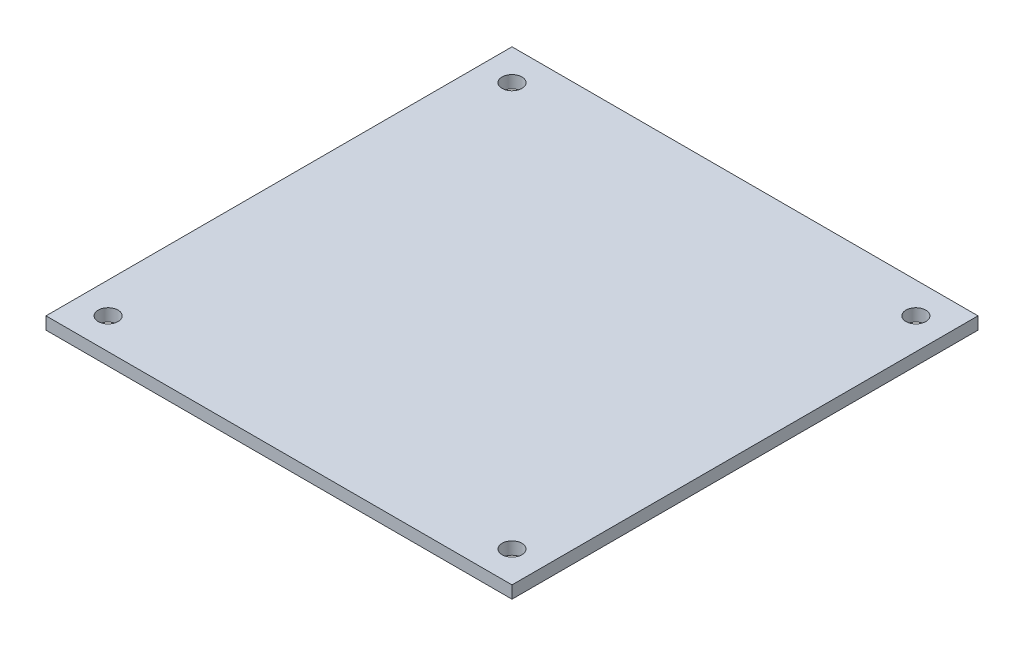
ISO-10303-21;
HEADER;
FILE_DESCRIPTION(('STEP AP214'),'2;1');
FILE_NAME('part.step','',(''),(''),'','','');
FILE_SCHEMA(('AUTOMOTIVE_DESIGN { 1 0 10303 214 1 1 1 1 }'));
ENDSEC;
DATA;
#1=APPLICATION_CONTEXT('core data for automotive mechanical design processes');
#2=APPLICATION_PROTOCOL_DEFINITION('international standard','automotive_design',2000,#1);
#3=PRODUCT_CONTEXT('',#1,'mechanical');
#4=PRODUCT('Part','Part','',(#3));
#5=PRODUCT_RELATED_PRODUCT_CATEGORY('part','',(#4));
#6=PRODUCT_DEFINITION_FORMATION('','',#4);
#7=PRODUCT_DEFINITION_CONTEXT('part definition',#1,'design');
#8=PRODUCT_DEFINITION('design','',#6,#7);
#9=PRODUCT_DEFINITION_SHAPE('','',#8);
#10=(LENGTH_UNIT() NAMED_UNIT(*) SI_UNIT(.MILLI.,.METRE.));
#11=(NAMED_UNIT(*) PLANE_ANGLE_UNIT() SI_UNIT($,.RADIAN.));
#12=(NAMED_UNIT(*) SI_UNIT($,.STERADIAN.) SOLID_ANGLE_UNIT());
#13=UNCERTAINTY_MEASURE_WITH_UNIT(LENGTH_MEASURE(1.E-05),#10,'distance_accuracy_value','');
#14=(GEOMETRIC_REPRESENTATION_CONTEXT(3) GLOBAL_UNCERTAINTY_ASSIGNED_CONTEXT((#13)) GLOBAL_UNIT_ASSIGNED_CONTEXT((#10,
#11,#12)) REPRESENTATION_CONTEXT('',''));
#15=CARTESIAN_POINT('',(0.,0.,0.));
#16=DIRECTION('',(0.,0.,1.));
#17=DIRECTION('',(1.,0.,0.));
#18=AXIS2_PLACEMENT_3D('',#15,#16,#17);
#19=CARTESIAN_POINT('',(0.,2.,-37.5));
#20=DIRECTION('',(0.,0.,-1.));
#21=DIRECTION('',(-1.,0.,0.));
#22=AXIS2_PLACEMENT_3D('',#19,#20,#21);
#23=PLANE('',#22);
#24=DIRECTION('',(1.,0.,0.));
#25=VECTOR('',#24,1.);
#26=CARTESIAN_POINT('',(0.,0.,-37.5));
#27=LINE('',#26,#25);
#28=CARTESIAN_POINT('',(-37.5,0.,-37.5));
#29=VERTEX_POINT('',#28);
#30=CARTESIAN_POINT('',(37.5,0.,-37.5));
#31=VERTEX_POINT('',#30);
#32=EDGE_CURVE('E125',#29,#31,#27,.T.);
#33=ORIENTED_EDGE('',*,*,#32,.F.);
#34=DIRECTION('',(0.,-1.,0.));
#35=VECTOR('',#34,1.);
#36=CARTESIAN_POINT('',(-37.5,2.,-37.5));
#37=LINE('',#36,#35);
#38=CARTESIAN_POINT('',(-37.5,2.,-37.5));
#39=VERTEX_POINT('',#38);
#40=EDGE_CURVE('E11',#39,#29,#37,.T.);
#41=ORIENTED_EDGE('',*,*,#40,.F.);
#42=DIRECTION('',(1.,0.,0.));
#43=VECTOR('',#42,1.);
#44=CARTESIAN_POINT('',(0.,2.,-37.5));
#45=LINE('',#44,#43);
#46=CARTESIAN_POINT('',(37.5,2.,-37.5));
#47=VERTEX_POINT('',#46);
#48=EDGE_CURVE('E102',#39,#47,#45,.T.);
#49=ORIENTED_EDGE('',*,*,#48,.T.);
#50=DIRECTION('',(0.,-1.,0.));
#51=VECTOR('',#50,1.);
#52=CARTESIAN_POINT('',(37.5,2.,-37.5));
#53=LINE('',#52,#51);
#54=EDGE_CURVE('E63',#47,#31,#53,.T.);
#55=ORIENTED_EDGE('',*,*,#54,.T.);
#56=EDGE_LOOP('',(#33,#41,#49,#55));
#57=FACE_BOUND('',#56,.T.);
#58=ADVANCED_FACE('F45',(#57),#23,.T.);
#59=CARTESIAN_POINT('',(-37.5,2.,0.));
#60=DIRECTION('',(1.,0.,0.));
#61=DIRECTION('',(0.,0.,-1.));
#62=AXIS2_PLACEMENT_3D('',#59,#60,#61);
#63=PLANE('',#62);
#64=DIRECTION('',(0.,0.,1.));
#65=VECTOR('',#64,1.);
#66=CARTESIAN_POINT('',(-37.5,0.,0.));
#67=LINE('',#66,#65);
#68=CARTESIAN_POINT('',(-37.5,0.,37.5));
#69=VERTEX_POINT('',#68);
#70=EDGE_CURVE('E108',#29,#69,#67,.T.);
#71=ORIENTED_EDGE('',*,*,#70,.T.);
#72=DIRECTION('',(0.,-1.,0.));
#73=VECTOR('',#72,1.);
#74=CARTESIAN_POINT('',(-37.5,2.,37.5));
#75=LINE('',#74,#73);
#76=CARTESIAN_POINT('',(-37.5,2.,37.5));
#77=VERTEX_POINT('',#76);
#78=EDGE_CURVE('E55',#77,#69,#75,.T.);
#79=ORIENTED_EDGE('',*,*,#78,.F.);
#80=DIRECTION('',(0.,0.,1.));
#81=VECTOR('',#80,1.);
#82=CARTESIAN_POINT('',(-37.5,2.,0.));
#83=LINE('',#82,#81);
#84=EDGE_CURVE('E98',#39,#77,#83,.T.);
#85=ORIENTED_EDGE('',*,*,#84,.F.);
#86=ORIENTED_EDGE('',*,*,#40,.T.);
#87=EDGE_LOOP('',(#71,#79,#85,#86));
#88=FACE_BOUND('',#87,.T.);
#89=ADVANCED_FACE('F106',(#88),#63,.F.);
#90=CARTESIAN_POINT('',(0.,2.,37.5));
#91=DIRECTION('',(0.,0.,-1.));
#92=DIRECTION('',(-1.,0.,0.));
#93=AXIS2_PLACEMENT_3D('',#90,#91,#92);
#94=PLANE('',#93);
#95=DIRECTION('',(1.,0.,0.));
#96=VECTOR('',#95,1.);
#97=CARTESIAN_POINT('',(0.,0.,37.5));
#98=LINE('',#97,#96);
#99=CARTESIAN_POINT('',(37.5,0.,37.5));
#100=VERTEX_POINT('',#99);
#101=EDGE_CURVE('E120',#69,#100,#98,.T.);
#102=ORIENTED_EDGE('',*,*,#101,.T.);
#103=DIRECTION('',(0.,-1.,0.));
#104=VECTOR('',#103,1.);
#105=CARTESIAN_POINT('',(37.5,2.,37.5));
#106=LINE('',#105,#104);
#107=CARTESIAN_POINT('',(37.5,2.,37.5));
#108=VERTEX_POINT('',#107);
#109=EDGE_CURVE('E77',#108,#100,#106,.T.);
#110=ORIENTED_EDGE('',*,*,#109,.F.);
#111=DIRECTION('',(1.,0.,0.));
#112=VECTOR('',#111,1.);
#113=CARTESIAN_POINT('',(0.,2.,37.5));
#114=LINE('',#113,#112);
#115=EDGE_CURVE('E89',#77,#108,#114,.T.);
#116=ORIENTED_EDGE('',*,*,#115,.F.);
#117=ORIENTED_EDGE('',*,*,#78,.T.);
#118=EDGE_LOOP('',(#102,#110,#116,#117));
#119=FACE_BOUND('',#118,.T.);
#120=ADVANCED_FACE('F91',(#119),#94,.F.);
#121=CARTESIAN_POINT('',(-32.5,2.,-32.5));
#122=DIRECTION('',(0.,-1.,0.));
#123=DIRECTION('',(0.,0.,-1.));
#124=AXIS2_PLACEMENT_3D('',#121,#122,#123);
#125=CYLINDRICAL_SURFACE('',#124,1.6);
#126=CARTESIAN_POINT('',(-32.5,2.,-32.5));
#127=DIRECTION('',(0.,1.,0.));
#128=DIRECTION('',(0.,0.,1.));
#129=AXIS2_PLACEMENT_3D('',#126,#127,#128);
#130=CIRCLE('',#129,1.6);
#131=CARTESIAN_POINT('',(-32.5,2.,-30.9));
#132=VERTEX_POINT('',#131);
#133=EDGE_CURVE('E148',#132,#132,#130,.T.);
#134=ORIENTED_EDGE('',*,*,#133,.T.);
#135=EDGE_LOOP('',(#134));
#136=FACE_BOUND('',#135,.T.);
#137=CARTESIAN_POINT('',(-32.5,0.,-32.5));
#138=DIRECTION('',(0.,1.,0.));
#139=DIRECTION('',(0.,0.,1.));
#140=AXIS2_PLACEMENT_3D('',#137,#138,#139);
#141=CIRCLE('',#140,1.6);
#142=CARTESIAN_POINT('',(-32.5,0.,-30.9));
#143=VERTEX_POINT('',#142);
#144=EDGE_CURVE('E128',#143,#143,#141,.T.);
#145=ORIENTED_EDGE('',*,*,#144,.F.);
#146=EDGE_LOOP('',(#145));
#147=FACE_BOUND('',#146,.T.);
#148=ADVANCED_FACE('F177',(#136,#147),#125,.F.);
#149=CARTESIAN_POINT('',(-32.5,2.,32.5));
#150=DIRECTION('',(0.,-1.,0.));
#151=DIRECTION('',(0.,0.,-1.));
#152=AXIS2_PLACEMENT_3D('',#149,#150,#151);
#153=CYLINDRICAL_SURFACE('',#152,1.6);
#154=CARTESIAN_POINT('',(-32.5,2.,32.5));
#155=DIRECTION('',(0.,1.,0.));
#156=DIRECTION('',(0.,0.,1.));
#157=AXIS2_PLACEMENT_3D('',#154,#155,#156);
#158=CIRCLE('',#157,1.6);
#159=CARTESIAN_POINT('',(-32.5,2.,34.1));
#160=VERTEX_POINT('',#159);
#161=EDGE_CURVE('E152',#160,#160,#158,.T.);
#162=ORIENTED_EDGE('',*,*,#161,.T.);
#163=EDGE_LOOP('',(#162));
#164=FACE_BOUND('',#163,.T.);
#165=CARTESIAN_POINT('',(-32.5,0.,32.5));
#166=DIRECTION('',(0.,1.,0.));
#167=DIRECTION('',(0.,0.,1.));
#168=AXIS2_PLACEMENT_3D('',#165,#166,#167);
#169=CIRCLE('',#168,1.6);
#170=CARTESIAN_POINT('',(-32.5,0.,34.1));
#171=VERTEX_POINT('',#170);
#172=EDGE_CURVE('E132',#171,#171,#169,.T.);
#173=ORIENTED_EDGE('',*,*,#172,.F.);
#174=EDGE_LOOP('',(#173));
#175=FACE_BOUND('',#174,.T.);
#176=ADVANCED_FACE('F180',(#164,#175),#153,.F.);
#177=CARTESIAN_POINT('',(32.5,2.,-32.5));
#178=DIRECTION('',(0.,-1.,0.));
#179=DIRECTION('',(0.,0.,-1.));
#180=AXIS2_PLACEMENT_3D('',#177,#178,#179);
#181=CYLINDRICAL_SURFACE('',#180,1.60000000000001);
#182=CARTESIAN_POINT('',(32.5,2.,-32.5));
#183=DIRECTION('',(0.,1.,0.));
#184=DIRECTION('',(0.,0.,1.));
#185=AXIS2_PLACEMENT_3D('',#182,#183,#184);
#186=CIRCLE('',#185,1.60000000000001);
#187=CARTESIAN_POINT('',(32.5,2.,-30.9));
#188=VERTEX_POINT('',#187);
#189=EDGE_CURVE('E156',#188,#188,#186,.T.);
#190=ORIENTED_EDGE('',*,*,#189,.T.);
#191=EDGE_LOOP('',(#190));
#192=FACE_BOUND('',#191,.T.);
#193=CARTESIAN_POINT('',(32.5,0.,-32.5));
#194=DIRECTION('',(0.,1.,0.));
#195=DIRECTION('',(0.,0.,1.));
#196=AXIS2_PLACEMENT_3D('',#193,#194,#195);
#197=CIRCLE('',#196,1.60000000000001);
#198=CARTESIAN_POINT('',(32.5,0.,-30.9));
#199=VERTEX_POINT('',#198);
#200=EDGE_CURVE('E136',#199,#199,#197,.T.);
#201=ORIENTED_EDGE('',*,*,#200,.F.);
#202=EDGE_LOOP('',(#201));
#203=FACE_BOUND('',#202,.T.);
#204=ADVANCED_FACE('F193',(#192,#203),#181,.F.);
#205=CARTESIAN_POINT('',(32.5,2.,32.5));
#206=DIRECTION('',(0.,-1.,0.));
#207=DIRECTION('',(0.,0.,-1.));
#208=AXIS2_PLACEMENT_3D('',#205,#206,#207);
#209=CYLINDRICAL_SURFACE('',#208,1.60000000000001);
#210=CARTESIAN_POINT('',(32.5,2.,32.5));
#211=DIRECTION('',(0.,1.,0.));
#212=DIRECTION('',(0.,0.,1.));
#213=AXIS2_PLACEMENT_3D('',#210,#211,#212);
#214=CIRCLE('',#213,1.60000000000001);
#215=CARTESIAN_POINT('',(32.5,2.,34.1));
#216=VERTEX_POINT('',#215);
#217=EDGE_CURVE('E119',#216,#216,#214,.T.);
#218=ORIENTED_EDGE('',*,*,#217,.T.);
#219=EDGE_LOOP('',(#218));
#220=FACE_BOUND('',#219,.T.);
#221=CARTESIAN_POINT('',(32.5,0.,32.5));
#222=DIRECTION('',(0.,1.,0.));
#223=DIRECTION('',(0.,0.,1.));
#224=AXIS2_PLACEMENT_3D('',#221,#222,#223);
#225=CIRCLE('',#224,1.60000000000001);
#226=CARTESIAN_POINT('',(32.5,0.,34.1));
#227=VERTEX_POINT('',#226);
#228=EDGE_CURVE('E140',#227,#227,#225,.T.);
#229=ORIENTED_EDGE('',*,*,#228,.F.);
#230=EDGE_LOOP('',(#229));
#231=FACE_BOUND('',#230,.T.);
#232=ADVANCED_FACE('F47',(#220,#231),#209,.F.);
#233=CARTESIAN_POINT('',(37.5,2.,0.));
#234=DIRECTION('',(1.,0.,0.));
#235=DIRECTION('',(0.,0.,-1.));
#236=AXIS2_PLACEMENT_3D('',#233,#234,#235);
#237=PLANE('',#236);
#238=DIRECTION('',(0.,0.,1.));
#239=VECTOR('',#238,1.);
#240=CARTESIAN_POINT('',(37.5,0.,0.));
#241=LINE('',#240,#239);
#242=EDGE_CURVE('E115',#31,#100,#241,.T.);
#243=ORIENTED_EDGE('',*,*,#242,.F.);
#244=ORIENTED_EDGE('',*,*,#54,.F.);
#245=DIRECTION('',(0.,0.,1.));
#246=VECTOR('',#245,1.);
#247=CARTESIAN_POINT('',(37.5,2.,0.));
#248=LINE('',#247,#246);
#249=EDGE_CURVE('E97',#47,#108,#248,.T.);
#250=ORIENTED_EDGE('',*,*,#249,.T.);
#251=ORIENTED_EDGE('',*,*,#109,.T.);
#252=EDGE_LOOP('',(#243,#244,#250,#251));
#253=FACE_BOUND('',#252,.T.);
#254=ADVANCED_FACE('F169',(#253),#237,.T.);
#255=CARTESIAN_POINT('',(0.,2.,0.));
#256=DIRECTION('',(0.,1.,0.));
#257=DIRECTION('',(0.,0.,1.));
#258=AXIS2_PLACEMENT_3D('',#255,#256,#257);
#259=PLANE('',#258);
#260=ORIENTED_EDGE('',*,*,#217,.F.);
#261=EDGE_LOOP('',(#260));
#262=FACE_BOUND('',#261,.T.);
#263=ORIENTED_EDGE('',*,*,#189,.F.);
#264=EDGE_LOOP('',(#263));
#265=FACE_BOUND('',#264,.T.);
#266=ORIENTED_EDGE('',*,*,#161,.F.);
#267=EDGE_LOOP('',(#266));
#268=FACE_BOUND('',#267,.T.);
#269=ORIENTED_EDGE('',*,*,#133,.F.);
#270=EDGE_LOOP('',(#269));
#271=FACE_BOUND('',#270,.T.);
#272=ORIENTED_EDGE('',*,*,#48,.F.);
#273=ORIENTED_EDGE('',*,*,#84,.T.);
#274=ORIENTED_EDGE('',*,*,#115,.T.);
#275=ORIENTED_EDGE('',*,*,#249,.F.);
#276=EDGE_LOOP('',(#272,#273,#274,#275));
#277=FACE_BOUND('',#276,.T.);
#278=ADVANCED_FACE('F101',(#262,#265,#268,#271,#277),#259,.T.);
#279=CARTESIAN_POINT('',(0.,0.,0.));
#280=DIRECTION('',(0.,1.,0.));
#281=DIRECTION('',(0.,0.,1.));
#282=AXIS2_PLACEMENT_3D('',#279,#280,#281);
#283=PLANE('',#282);
#284=ORIENTED_EDGE('',*,*,#228,.T.);
#285=EDGE_LOOP('',(#284));
#286=FACE_BOUND('',#285,.T.);
#287=ORIENTED_EDGE('',*,*,#200,.T.);
#288=EDGE_LOOP('',(#287));
#289=FACE_BOUND('',#288,.T.);
#290=ORIENTED_EDGE('',*,*,#172,.T.);
#291=EDGE_LOOP('',(#290));
#292=FACE_BOUND('',#291,.T.);
#293=ORIENTED_EDGE('',*,*,#144,.T.);
#294=EDGE_LOOP('',(#293));
#295=FACE_BOUND('',#294,.T.);
#296=ORIENTED_EDGE('',*,*,#32,.T.);
#297=ORIENTED_EDGE('',*,*,#242,.T.);
#298=ORIENTED_EDGE('',*,*,#101,.F.);
#299=ORIENTED_EDGE('',*,*,#70,.F.);
#300=EDGE_LOOP('',(#296,#297,#298,#299));
#301=FACE_BOUND('',#300,.T.);
#302=ADVANCED_FACE('F168',(#286,#289,#292,#295,#301),#283,.F.);
#303=CLOSED_SHELL('',(#58,#89,#120,#148,#176,#204,#232,#254,#278,#302));
#304=MANIFOLD_SOLID_BREP('B2',#303);
#305=ADVANCED_BREP_SHAPE_REPRESENTATION('',(#18,#304),#14);
#306=SHAPE_DEFINITION_REPRESENTATION(#9,#305);
ENDSEC;
END-ISO-10303-21;
